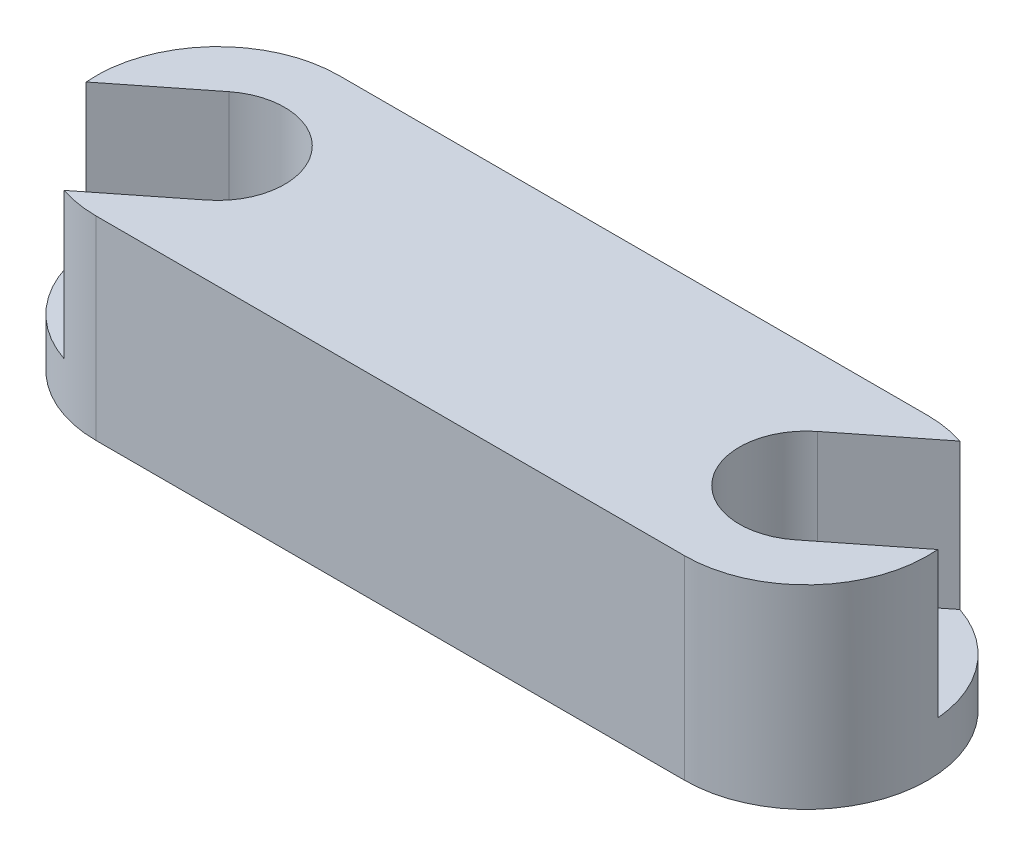
ISO-10303-21;
HEADER;
FILE_DESCRIPTION(('STEP AP214'),'2;1');
FILE_NAME('part.step','',(''),(''),'','','');
FILE_SCHEMA(('AUTOMOTIVE_DESIGN { 1 0 10303 214 1 1 1 1 }'));
ENDSEC;
DATA;
#1=APPLICATION_CONTEXT('core data for automotive mechanical design processes');
#2=APPLICATION_PROTOCOL_DEFINITION('international standard','automotive_design',2000,#1);
#3=PRODUCT_CONTEXT('',#1,'mechanical');
#4=PRODUCT('Part','Part','',(#3));
#5=PRODUCT_RELATED_PRODUCT_CATEGORY('part','',(#4));
#6=PRODUCT_DEFINITION_FORMATION('','',#4);
#7=PRODUCT_DEFINITION_CONTEXT('part definition',#1,'design');
#8=PRODUCT_DEFINITION('design','',#6,#7);
#9=PRODUCT_DEFINITION_SHAPE('','',#8);
#10=(LENGTH_UNIT() NAMED_UNIT(*) SI_UNIT(.MILLI.,.METRE.));
#11=(NAMED_UNIT(*) PLANE_ANGLE_UNIT() SI_UNIT($,.RADIAN.));
#12=(NAMED_UNIT(*) SI_UNIT($,.STERADIAN.) SOLID_ANGLE_UNIT());
#13=UNCERTAINTY_MEASURE_WITH_UNIT(LENGTH_MEASURE(1.E-05),#10,'distance_accuracy_value','');
#14=(GEOMETRIC_REPRESENTATION_CONTEXT(3) GLOBAL_UNCERTAINTY_ASSIGNED_CONTEXT((#13)) GLOBAL_UNIT_ASSIGNED_CONTEXT((#10,
#11,#12)) REPRESENTATION_CONTEXT('',''));
#15=CARTESIAN_POINT('',(0.,0.,0.));
#16=DIRECTION('',(0.,0.,1.));
#17=DIRECTION('',(1.,0.,0.));
#18=AXIS2_PLACEMENT_3D('',#15,#16,#17);
#19=CARTESIAN_POINT('',(-7.71252727608147,8.,-1.5));
#20=DIRECTION('',(0.,1.,0.));
#21=DIRECTION('',(0.,0.,1.));
#22=AXIS2_PLACEMENT_3D('',#19,#20,#21);
#23=PLANE('',#22);
#24=DIRECTION('',(0.784882765557683,0.,-0.619644288548295));
#25=VECTOR('',#24,1.);
#26=CARTESIAN_POINT('',(-6.00850548257364,8.,0.658427605283627));
#27=LINE('',#26,#25);
#28=CARTESIAN_POINT('',(-9.2860372008773,8.,3.2459526458414));
#29=VERTEX_POINT('',#28);
#30=CARTESIAN_POINT('',(-6.00850548257364,8.,0.658427605283627));
#31=VERTEX_POINT('',#30);
#32=EDGE_CURVE('E179',#29,#31,#27,.T.);
#33=ORIENTED_EDGE('',*,*,#32,.F.);
#34=CARTESIAN_POINT('',(-7.71252727608147,8.,-1.5));
#35=DIRECTION('',(0.,1.,0.));
#36=DIRECTION('',(0.,0.,1.));
#37=AXIS2_PLACEMENT_3D('',#34,#35,#36);
#38=CIRCLE('',#37,5.);
#39=CARTESIAN_POINT('',(-7.71252727608147,8.,3.5));
#40=VERTEX_POINT('',#39);
#41=EDGE_CURVE('E218',#29,#40,#38,.T.);
#42=ORIENTED_EDGE('',*,*,#41,.T.);
#43=DIRECTION('',(1.,0.,0.));
#44=VECTOR('',#43,1.);
#45=CARTESIAN_POINT('',(-7.71252727608147,8.,3.5));
#46=LINE('',#45,#44);
#47=CARTESIAN_POINT('',(16.4949095939185,8.,3.5));
#48=VERTEX_POINT('',#47);
#49=EDGE_CURVE('E217',#40,#48,#46,.T.);
#50=ORIENTED_EDGE('',*,*,#49,.T.);
#51=CARTESIAN_POINT('',(16.4949095939185,8.,-1.5));
#52=DIRECTION('',(0.,1.,0.));
#53=DIRECTION('',(0.,0.,1.));
#54=AXIS2_PLACEMENT_3D('',#51,#52,#53);
#55=CIRCLE('',#54,5.);
#56=CARTESIAN_POINT('',(21.47646310573,8.,-1.92909743527415));
#57=VERTEX_POINT('',#56);
#58=EDGE_CURVE('E222',#48,#57,#55,.T.);
#59=ORIENTED_EDGE('',*,*,#58,.T.);
#60=DIRECTION('',(0.784882765557684,0.,-0.619644288548295));
#61=VECTOR('',#60,1.);
#62=CARTESIAN_POINT('',(18.1989313874263,8.,0.658427605283628));
#63=LINE('',#62,#61);
#64=CARTESIAN_POINT('',(18.1989313874263,8.,0.658427605283628));
#65=VERTEX_POINT('',#64);
#66=EDGE_CURVE('E167',#65,#57,#63,.T.);
#67=ORIENTED_EDGE('',*,*,#66,.F.);
#68=CARTESIAN_POINT('',(16.4949095939185,8.,-1.5));
#69=DIRECTION('',(0.,1.,0.));
#70=DIRECTION('',(0.,0.,1.));
#71=AXIS2_PLACEMENT_3D('',#68,#69,#70);
#72=CIRCLE('',#71,2.75);
#73=CARTESIAN_POINT('',(14.7908878004107,8.,-3.65842760528363));
#74=VERTEX_POINT('',#73);
#75=EDGE_CURVE('E199',#74,#65,#72,.T.);
#76=ORIENTED_EDGE('',*,*,#75,.F.);
#77=DIRECTION('',(-0.784882765557683,0.,0.619644288548295));
#78=VECTOR('',#77,1.);
#79=CARTESIAN_POINT('',(14.7908878004107,8.,-3.65842760528363));
#80=LINE('',#79,#78);
#81=CARTESIAN_POINT('',(18.0684195187144,8.,-6.2459526458414));
#82=VERTEX_POINT('',#81);
#83=EDGE_CURVE('E171',#82,#74,#80,.T.);
#84=ORIENTED_EDGE('',*,*,#83,.F.);
#85=CARTESIAN_POINT('',(16.4949095939185,8.,-6.5));
#86=VERTEX_POINT('',#85);
#87=EDGE_CURVE('E221',#82,#86,#55,.T.);
#88=ORIENTED_EDGE('',*,*,#87,.T.);
#89=DIRECTION('',(-1.,0.,0.));
#90=VECTOR('',#89,1.);
#91=CARTESIAN_POINT('',(-7.71252727608147,8.,-6.5));
#92=LINE('',#91,#90);
#93=CARTESIAN_POINT('',(-7.71252727608147,8.,-6.5));
#94=VERTEX_POINT('',#93);
#95=EDGE_CURVE('E226',#86,#94,#92,.T.);
#96=ORIENTED_EDGE('',*,*,#95,.T.);
#97=CARTESIAN_POINT('',(-12.6940807878929,8.,-1.07090256472584));
#98=VERTEX_POINT('',#97);
#99=EDGE_CURVE('E213',#94,#98,#38,.T.);
#100=ORIENTED_EDGE('',*,*,#99,.T.);
#101=DIRECTION('',(-0.784882765557683,0.,0.619644288548295));
#102=VECTOR('',#101,1.);
#103=CARTESIAN_POINT('',(-9.41654906958926,8.,-3.65842760528363));
#104=LINE('',#103,#102);
#105=CARTESIAN_POINT('',(-9.41654906958926,8.,-3.65842760528363));
#106=VERTEX_POINT('',#105);
#107=EDGE_CURVE('E160',#106,#98,#104,.T.);
#108=ORIENTED_EDGE('',*,*,#107,.F.);
#109=CARTESIAN_POINT('',(-7.71252727608147,8.,-1.5));
#110=DIRECTION('',(0.,1.,0.));
#111=DIRECTION('',(0.,0.,1.));
#112=AXIS2_PLACEMENT_3D('',#109,#110,#111);
#113=CIRCLE('',#112,2.75);
#114=EDGE_CURVE('E149',#31,#106,#113,.T.);
#115=ORIENTED_EDGE('',*,*,#114,.F.);
#116=EDGE_LOOP('',(#33,#42,#50,#59,#67,#76,#84,#88,#96,#100,#108,#115));
#117=FACE_BOUND('',#116,.T.);
#118=ADVANCED_FACE('F39',(#117),#23,.T.);
#119=CARTESIAN_POINT('',(-7.71252727608147,0.,-1.5));
#120=DIRECTION('',(0.,1.,0.));
#121=DIRECTION('',(0.,0.,1.));
#122=AXIS2_PLACEMENT_3D('',#119,#120,#121);
#123=PLANE('',#122);
#124=CARTESIAN_POINT('',(-7.71252727608147,0.,-1.5));
#125=DIRECTION('',(0.,1.,0.));
#126=DIRECTION('',(0.,0.,1.));
#127=AXIS2_PLACEMENT_3D('',#124,#125,#126);
#128=CIRCLE('',#127,5.);
#129=CARTESIAN_POINT('',(-7.71252727608147,0.,-6.5));
#130=VERTEX_POINT('',#129);
#131=CARTESIAN_POINT('',(-7.71252727608147,0.,3.5));
#132=VERTEX_POINT('',#131);
#133=EDGE_CURVE('E209',#130,#132,#128,.T.);
#134=ORIENTED_EDGE('',*,*,#133,.F.);
#135=DIRECTION('',(-1.,0.,0.));
#136=VECTOR('',#135,1.);
#137=CARTESIAN_POINT('',(-7.71252727608147,0.,-6.5));
#138=LINE('',#137,#136);
#139=CARTESIAN_POINT('',(16.4949095939185,0.,-6.5));
#140=VERTEX_POINT('',#139);
#141=EDGE_CURVE('E239',#140,#130,#138,.T.);
#142=ORIENTED_EDGE('',*,*,#141,.F.);
#143=CARTESIAN_POINT('',(16.4949095939185,0.,-1.5));
#144=DIRECTION('',(0.,1.,0.));
#145=DIRECTION('',(0.,0.,1.));
#146=AXIS2_PLACEMENT_3D('',#143,#144,#145);
#147=CIRCLE('',#146,5.);
#148=CARTESIAN_POINT('',(16.4949095939185,0.,3.5));
#149=VERTEX_POINT('',#148);
#150=EDGE_CURVE('E236',#149,#140,#147,.T.);
#151=ORIENTED_EDGE('',*,*,#150,.F.);
#152=DIRECTION('',(1.,0.,0.));
#153=VECTOR('',#152,1.);
#154=CARTESIAN_POINT('',(-7.71252727608147,0.,3.5));
#155=LINE('',#154,#153);
#156=EDGE_CURVE('E233',#132,#149,#155,.T.);
#157=ORIENTED_EDGE('',*,*,#156,.F.);
#158=EDGE_LOOP('',(#134,#142,#151,#157));
#159=FACE_BOUND('',#158,.T.);
#160=CARTESIAN_POINT('',(-7.71252727608147,0.,-1.5));
#161=DIRECTION('',(0.,1.,0.));
#162=DIRECTION('',(0.,0.,1.));
#163=AXIS2_PLACEMENT_3D('',#160,#161,#162);
#164=CIRCLE('',#163,2.75);
#165=CARTESIAN_POINT('',(-7.71252727608147,0.,1.25));
#166=VERTEX_POINT('',#165);
#167=EDGE_CURVE('E203',#166,#166,#164,.T.);
#168=ORIENTED_EDGE('',*,*,#167,.T.);
#169=EDGE_LOOP('',(#168));
#170=FACE_BOUND('',#169,.T.);
#171=CARTESIAN_POINT('',(16.4949095939185,0.,-1.5));
#172=DIRECTION('',(0.,1.,0.));
#173=DIRECTION('',(0.,0.,1.));
#174=AXIS2_PLACEMENT_3D('',#171,#172,#173);
#175=CIRCLE('',#174,2.75);
#176=CARTESIAN_POINT('',(16.4949095939185,0.,1.25));
#177=VERTEX_POINT('',#176);
#178=EDGE_CURVE('E198',#177,#177,#175,.T.);
#179=ORIENTED_EDGE('',*,*,#178,.T.);
#180=EDGE_LOOP('',(#179));
#181=FACE_BOUND('',#180,.T.);
#182=ADVANCED_FACE('F286',(#159,#170,#181),#123,.F.);
#183=CARTESIAN_POINT('',(-7.71252727608147,8.,-1.5));
#184=DIRECTION('',(0.,-1.,0.));
#185=DIRECTION('',(0.,0.,-1.));
#186=AXIS2_PLACEMENT_3D('',#183,#184,#185);
#187=CYLINDRICAL_SURFACE('',#186,5.);
#188=ORIENTED_EDGE('',*,*,#41,.F.);
#189=DIRECTION('',(0.,-1.,0.));
#190=VECTOR('',#189,1.);
#191=CARTESIAN_POINT('',(-9.2860372008773,8.,3.2459526458414));
#192=LINE('',#191,#190);
#193=CARTESIAN_POINT('',(-9.2860372008773,2.,3.2459526458414));
#194=VERTEX_POINT('',#193);
#195=EDGE_CURVE('E194',#29,#194,#192,.T.);
#196=ORIENTED_EDGE('',*,*,#195,.T.);
#197=CARTESIAN_POINT('',(-7.71252727608147,2.,-1.5));
#198=DIRECTION('',(0.,-1.,0.));
#199=DIRECTION('',(0.,0.,-1.));
#200=AXIS2_PLACEMENT_3D('',#197,#198,#199);
#201=CIRCLE('',#200,5.);
#202=CARTESIAN_POINT('',(-12.6940807878929,2.,-1.07090256472584));
#203=VERTEX_POINT('',#202);
#204=EDGE_CURVE('E189',#194,#203,#201,.T.);
#205=ORIENTED_EDGE('',*,*,#204,.T.);
#206=DIRECTION('',(0.,-1.,0.));
#207=VECTOR('',#206,1.);
#208=CARTESIAN_POINT('',(-12.6940807878929,8.,-1.07090256472584));
#209=LINE('',#208,#207);
#210=EDGE_CURVE('E142',#203,#98,#209,.F.);
#211=ORIENTED_EDGE('',*,*,#210,.T.);
#212=ORIENTED_EDGE('',*,*,#99,.F.);
#213=DIRECTION('',(0.,-1.,0.));
#214=VECTOR('',#213,1.);
#215=CARTESIAN_POINT('',(-7.71252727608147,8.,-6.5));
#216=LINE('',#215,#214);
#217=EDGE_CURVE('E229',#94,#130,#216,.T.);
#218=ORIENTED_EDGE('',*,*,#217,.T.);
#219=ORIENTED_EDGE('',*,*,#133,.T.);
#220=DIRECTION('',(0.,-1.,0.));
#221=VECTOR('',#220,1.);
#222=CARTESIAN_POINT('',(-7.71252727608147,8.,3.5));
#223=LINE('',#222,#221);
#224=EDGE_CURVE('E253',#40,#132,#223,.T.);
#225=ORIENTED_EDGE('',*,*,#224,.F.);
#226=EDGE_LOOP('',(#188,#196,#205,#211,#212,#218,#219,#225));
#227=FACE_BOUND('',#226,.T.);
#228=ADVANCED_FACE('F41',(#227),#187,.T.);
#229=CARTESIAN_POINT('',(-7.71252727608147,8.,3.5));
#230=DIRECTION('',(0.,0.,-1.));
#231=DIRECTION('',(-1.,0.,0.));
#232=AXIS2_PLACEMENT_3D('',#229,#230,#231);
#233=PLANE('',#232);
#234=ORIENTED_EDGE('',*,*,#156,.T.);
#235=DIRECTION('',(0.,-1.,0.));
#236=VECTOR('',#235,1.);
#237=CARTESIAN_POINT('',(16.4949095939185,8.,3.5));
#238=LINE('',#237,#236);
#239=EDGE_CURVE('E249',#48,#149,#238,.T.);
#240=ORIENTED_EDGE('',*,*,#239,.F.);
#241=ORIENTED_EDGE('',*,*,#49,.F.);
#242=ORIENTED_EDGE('',*,*,#224,.T.);
#243=EDGE_LOOP('',(#234,#240,#241,#242));
#244=FACE_BOUND('',#243,.T.);
#245=ADVANCED_FACE('F300',(#244),#233,.F.);
#246=CARTESIAN_POINT('',(16.4949095939185,8.,-1.5));
#247=DIRECTION('',(0.,-1.,0.));
#248=DIRECTION('',(0.,0.,-1.));
#249=AXIS2_PLACEMENT_3D('',#246,#247,#248);
#250=CYLINDRICAL_SURFACE('',#249,5.);
#251=ORIENTED_EDGE('',*,*,#87,.F.);
#252=DIRECTION('',(0.,-1.,0.));
#253=VECTOR('',#252,1.);
#254=CARTESIAN_POINT('',(18.0684195187144,8.,-6.2459526458414));
#255=LINE('',#254,#253);
#256=CARTESIAN_POINT('',(18.0684195187144,2.,-6.2459526458414));
#257=VERTEX_POINT('',#256);
#258=EDGE_CURVE('E185',#82,#257,#255,.T.);
#259=ORIENTED_EDGE('',*,*,#258,.T.);
#260=CARTESIAN_POINT('',(16.4949095939185,2.,-1.5));
#261=DIRECTION('',(0.,-1.,0.));
#262=DIRECTION('',(0.,0.,-1.));
#263=AXIS2_PLACEMENT_3D('',#260,#261,#262);
#264=CIRCLE('',#263,5.);
#265=CARTESIAN_POINT('',(21.47646310573,2.,-1.92909743527415));
#266=VERTEX_POINT('',#265);
#267=EDGE_CURVE('E151',#257,#266,#264,.T.);
#268=ORIENTED_EDGE('',*,*,#267,.T.);
#269=DIRECTION('',(0.,-1.,0.));
#270=VECTOR('',#269,1.);
#271=CARTESIAN_POINT('',(21.47646310573,8.,-1.92909743527414));
#272=LINE('',#271,#270);
#273=EDGE_CURVE('E156',#266,#57,#272,.F.);
#274=ORIENTED_EDGE('',*,*,#273,.T.);
#275=ORIENTED_EDGE('',*,*,#58,.F.);
#276=ORIENTED_EDGE('',*,*,#239,.T.);
#277=ORIENTED_EDGE('',*,*,#150,.T.);
#278=DIRECTION('',(0.,-1.,0.));
#279=VECTOR('',#278,1.);
#280=CARTESIAN_POINT('',(16.4949095939185,8.,-6.5));
#281=LINE('',#280,#279);
#282=EDGE_CURVE('E245',#86,#140,#281,.T.);
#283=ORIENTED_EDGE('',*,*,#282,.F.);
#284=EDGE_LOOP('',(#251,#259,#268,#274,#275,#276,#277,#283));
#285=FACE_BOUND('',#284,.T.);
#286=ADVANCED_FACE('F275',(#285),#250,.T.);
#287=CARTESIAN_POINT('',(-7.71252727608147,8.,-6.5));
#288=DIRECTION('',(0.,0.,1.));
#289=DIRECTION('',(1.,0.,0.));
#290=AXIS2_PLACEMENT_3D('',#287,#288,#289);
#291=PLANE('',#290);
#292=ORIENTED_EDGE('',*,*,#141,.T.);
#293=ORIENTED_EDGE('',*,*,#217,.F.);
#294=ORIENTED_EDGE('',*,*,#95,.F.);
#295=ORIENTED_EDGE('',*,*,#282,.T.);
#296=EDGE_LOOP('',(#292,#293,#294,#295));
#297=FACE_BOUND('',#296,.T.);
#298=ADVANCED_FACE('F295',(#297),#291,.F.);
#299=CARTESIAN_POINT('',(-7.71252727608147,8.,-1.5));
#300=DIRECTION('',(0.,-1.,0.));
#301=DIRECTION('',(0.,0.,-1.));
#302=AXIS2_PLACEMENT_3D('',#299,#300,#301);
#303=CYLINDRICAL_SURFACE('',#302,2.75);
#304=DIRECTION('',(0.,1.,0.));
#305=VECTOR('',#304,1.);
#306=CARTESIAN_POINT('',(-6.00850548257364,2.,0.658427605283627));
#307=LINE('',#306,#305);
#308=CARTESIAN_POINT('',(-6.00850548257365,2.,0.658427605283623));
#309=VERTEX_POINT('',#308);
#310=EDGE_CURVE('E55',#309,#31,#307,.T.);
#311=ORIENTED_EDGE('',*,*,#310,.T.);
#312=ORIENTED_EDGE('',*,*,#114,.T.);
#313=DIRECTION('',(0.,1.,0.));
#314=VECTOR('',#313,1.);
#315=CARTESIAN_POINT('',(-9.41654906958926,2.,-3.65842760528363));
#316=LINE('',#315,#314);
#317=CARTESIAN_POINT('',(-9.41654906958926,2.,-3.65842760528363));
#318=VERTEX_POINT('',#317);
#319=EDGE_CURVE('E139',#318,#106,#316,.T.);
#320=ORIENTED_EDGE('',*,*,#319,.F.);
#321=CARTESIAN_POINT('',(-7.71252727608147,2.,-1.5));
#322=DIRECTION('',(0.,-1.,0.));
#323=DIRECTION('',(0.,0.,-1.));
#324=AXIS2_PLACEMENT_3D('',#321,#322,#323);
#325=CIRCLE('',#324,2.75);
#326=EDGE_CURVE('E11',#309,#318,#325,.T.);
#327=ORIENTED_EDGE('',*,*,#326,.F.);
#328=EDGE_LOOP('',(#311,#312,#320,#327));
#329=FACE_BOUND('',#328,.T.);
#330=ORIENTED_EDGE('',*,*,#167,.F.);
#331=EDGE_LOOP('',(#330));
#332=FACE_BOUND('',#331,.T.);
#333=ADVANCED_FACE('F146',(#329,#332),#303,.F.);
#334=CARTESIAN_POINT('',(16.4949095939185,8.,-1.5));
#335=DIRECTION('',(0.,-1.,0.));
#336=DIRECTION('',(0.,0.,-1.));
#337=AXIS2_PLACEMENT_3D('',#334,#335,#336);
#338=CYLINDRICAL_SURFACE('',#337,2.75);
#339=DIRECTION('',(0.,1.,0.));
#340=VECTOR('',#339,1.);
#341=CARTESIAN_POINT('',(14.7908878004107,2.,-3.65842760528363));
#342=LINE('',#341,#340);
#343=CARTESIAN_POINT('',(14.7908878004107,2.,-3.65842760528363));
#344=VERTEX_POINT('',#343);
#345=EDGE_CURVE('E63',#344,#74,#342,.T.);
#346=ORIENTED_EDGE('',*,*,#345,.T.);
#347=ORIENTED_EDGE('',*,*,#75,.T.);
#348=DIRECTION('',(0.,1.,0.));
#349=VECTOR('',#348,1.);
#350=CARTESIAN_POINT('',(18.1989313874263,2.,0.658427605283628));
#351=LINE('',#350,#349);
#352=CARTESIAN_POINT('',(18.1989313874263,2.,0.658427605283628));
#353=VERTEX_POINT('',#352);
#354=EDGE_CURVE('E176',#353,#65,#351,.T.);
#355=ORIENTED_EDGE('',*,*,#354,.F.);
#356=CARTESIAN_POINT('',(16.4949095939185,2.,-1.5));
#357=DIRECTION('',(0.,-1.,0.));
#358=DIRECTION('',(0.,0.,-1.));
#359=AXIS2_PLACEMENT_3D('',#356,#357,#358);
#360=CIRCLE('',#359,2.75);
#361=EDGE_CURVE('E48',#344,#353,#360,.T.);
#362=ORIENTED_EDGE('',*,*,#361,.F.);
#363=EDGE_LOOP('',(#346,#347,#355,#362));
#364=FACE_BOUND('',#363,.T.);
#365=ORIENTED_EDGE('',*,*,#178,.F.);
#366=EDGE_LOOP('',(#365));
#367=FACE_BOUND('',#366,.T.);
#368=ADVANCED_FACE('F266',(#364,#367),#338,.F.);
#369=CARTESIAN_POINT('',(14.7908878004107,2.,-3.65842760528363));
#370=DIRECTION('',(-0.619644288548295,0.,-0.784882765557683));
#371=DIRECTION('',(-0.784882765557683,0.,0.619644288548295));
#372=AXIS2_PLACEMENT_3D('',#369,#370,#371);
#373=PLANE('',#372);
#374=ORIENTED_EDGE('',*,*,#83,.T.);
#375=ORIENTED_EDGE('',*,*,#345,.F.);
#376=DIRECTION('',(-0.784882765557683,0.,0.619644288548295));
#377=VECTOR('',#376,1.);
#378=CARTESIAN_POINT('',(14.7908878004107,2.,-3.65842760528363));
#379=LINE('',#378,#377);
#380=EDGE_CURVE('E163',#257,#344,#379,.T.);
#381=ORIENTED_EDGE('',*,*,#380,.F.);
#382=ORIENTED_EDGE('',*,*,#258,.F.);
#383=EDGE_LOOP('',(#374,#375,#381,#382));
#384=FACE_BOUND('',#383,.T.);
#385=ADVANCED_FACE('F276',(#384),#373,.F.);
#386=CARTESIAN_POINT('',(18.1989313874263,2.,0.658427605283628));
#387=DIRECTION('',(0.619644288548295,0.,0.784882765557684));
#388=DIRECTION('',(0.784882765557684,0.,-0.619644288548295));
#389=AXIS2_PLACEMENT_3D('',#386,#387,#388);
#390=PLANE('',#389);
#391=DIRECTION('',(0.784882765557684,0.,-0.619644288548295));
#392=VECTOR('',#391,1.);
#393=CARTESIAN_POINT('',(18.1989313874263,2.,0.658427605283628));
#394=LINE('',#393,#392);
#395=EDGE_CURVE('E166',#353,#266,#394,.T.);
#396=ORIENTED_EDGE('',*,*,#395,.F.);
#397=ORIENTED_EDGE('',*,*,#354,.T.);
#398=ORIENTED_EDGE('',*,*,#66,.T.);
#399=ORIENTED_EDGE('',*,*,#273,.F.);
#400=EDGE_LOOP('',(#396,#397,#398,#399));
#401=FACE_BOUND('',#400,.T.);
#402=ADVANCED_FACE('F264',(#401),#390,.F.);
#403=CARTESIAN_POINT('',(0.,2.,0.));
#404=DIRECTION('',(0.,-1.,0.));
#405=DIRECTION('',(0.,0.,-1.));
#406=AXIS2_PLACEMENT_3D('',#403,#404,#405);
#407=PLANE('',#406);
#408=ORIENTED_EDGE('',*,*,#380,.T.);
#409=ORIENTED_EDGE('',*,*,#361,.T.);
#410=ORIENTED_EDGE('',*,*,#395,.T.);
#411=ORIENTED_EDGE('',*,*,#267,.F.);
#412=EDGE_LOOP('',(#408,#409,#410,#411));
#413=FACE_BOUND('',#412,.T.);
#414=ADVANCED_FACE('F260',(#413),#407,.F.);
#415=CARTESIAN_POINT('',(-6.00850548257364,2.,0.658427605283627));
#416=DIRECTION('',(0.619644288548295,0.,0.784882765557683));
#417=DIRECTION('',(0.784882765557683,0.,-0.619644288548295));
#418=AXIS2_PLACEMENT_3D('',#415,#416,#417);
#419=PLANE('',#418);
#420=ORIENTED_EDGE('',*,*,#32,.T.);
#421=ORIENTED_EDGE('',*,*,#310,.F.);
#422=DIRECTION('',(0.784882765557683,0.,-0.619644288548295));
#423=VECTOR('',#422,1.);
#424=CARTESIAN_POINT('',(-6.00850548257364,2.,0.658427605283627));
#425=LINE('',#424,#423);
#426=EDGE_CURVE('E134',#194,#309,#425,.T.);
#427=ORIENTED_EDGE('',*,*,#426,.F.);
#428=ORIENTED_EDGE('',*,*,#195,.F.);
#429=EDGE_LOOP('',(#420,#421,#427,#428));
#430=FACE_BOUND('',#429,.T.);
#431=ADVANCED_FACE('F321',(#430),#419,.F.);
#432=CARTESIAN_POINT('',(-9.41654906958926,2.,-3.65842760528363));
#433=DIRECTION('',(-0.619644288548295,0.,-0.784882765557683));
#434=DIRECTION('',(-0.784882765557683,0.,0.619644288548295));
#435=AXIS2_PLACEMENT_3D('',#432,#433,#434);
#436=PLANE('',#435);
#437=DIRECTION('',(-0.784882765557683,0.,0.619644288548295));
#438=VECTOR('',#437,1.);
#439=CARTESIAN_POINT('',(-9.41654906958926,2.,-3.65842760528363));
#440=LINE('',#439,#438);
#441=EDGE_CURVE('E132',#318,#203,#440,.T.);
#442=ORIENTED_EDGE('',*,*,#441,.F.);
#443=ORIENTED_EDGE('',*,*,#319,.T.);
#444=ORIENTED_EDGE('',*,*,#107,.T.);
#445=ORIENTED_EDGE('',*,*,#210,.F.);
#446=EDGE_LOOP('',(#442,#443,#444,#445));
#447=FACE_BOUND('',#446,.T.);
#448=ADVANCED_FACE('F138',(#447),#436,.F.);
#449=CARTESIAN_POINT('',(0.,2.,0.));
#450=DIRECTION('',(0.,-1.,0.));
#451=DIRECTION('',(0.,0.,-1.));
#452=AXIS2_PLACEMENT_3D('',#449,#450,#451);
#453=PLANE('',#452);
#454=ORIENTED_EDGE('',*,*,#426,.T.);
#455=ORIENTED_EDGE('',*,*,#326,.T.);
#456=ORIENTED_EDGE('',*,*,#441,.T.);
#457=ORIENTED_EDGE('',*,*,#204,.F.);
#458=EDGE_LOOP('',(#454,#455,#456,#457));
#459=FACE_BOUND('',#458,.T.);
#460=ADVANCED_FACE('F131',(#459),#453,.F.);
#461=CLOSED_SHELL('',(#118,#182,#228,#245,#286,#298,#333,#368,#385,#402,#414,#431,#448,#460));
#462=MANIFOLD_SOLID_BREP('B2',#461);
#463=ADVANCED_BREP_SHAPE_REPRESENTATION('',(#18,#462),#14);
#464=SHAPE_DEFINITION_REPRESENTATION(#9,#463);
ENDSEC;
END-ISO-10303-21;
